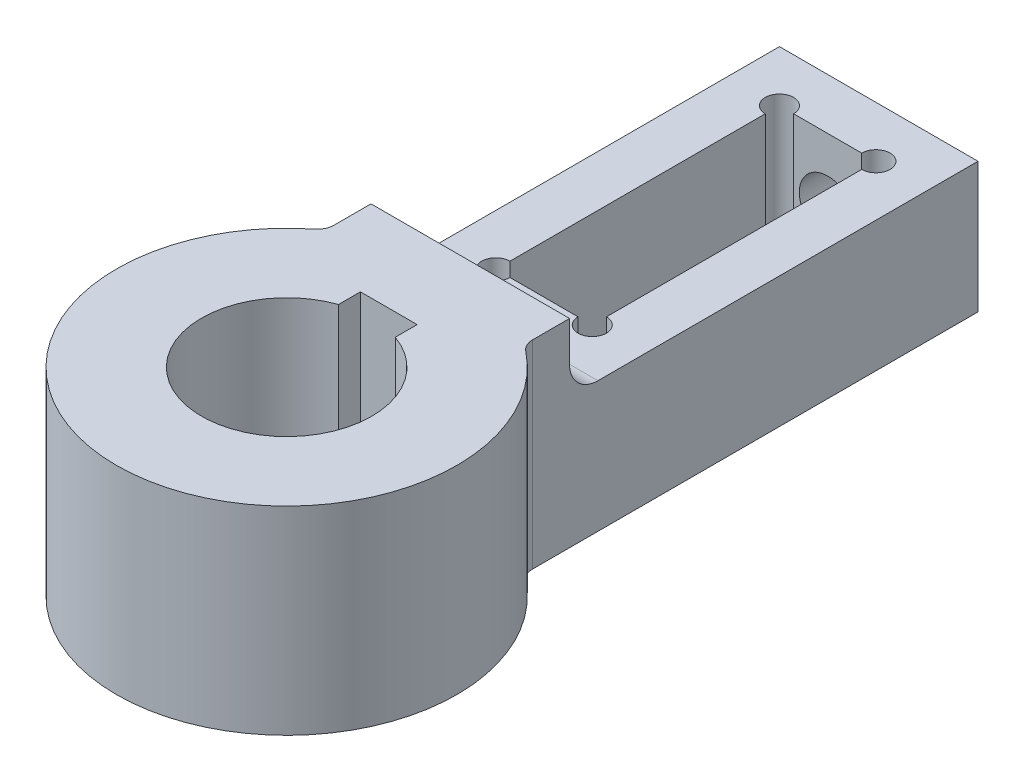
ISO-10303-21;
HEADER;
FILE_DESCRIPTION(('STEP AP214'),'2;1');
FILE_NAME('part.step','',(''),(''),'','','');
FILE_SCHEMA(('AUTOMOTIVE_DESIGN { 1 0 10303 214 1 1 1 1 }'));
ENDSEC;
DATA;
#1=APPLICATION_CONTEXT('core data for automotive mechanical design processes');
#2=APPLICATION_PROTOCOL_DEFINITION('international standard','automotive_design',2000,#1);
#3=PRODUCT_CONTEXT('',#1,'mechanical');
#4=PRODUCT('Part','Part','',(#3));
#5=PRODUCT_RELATED_PRODUCT_CATEGORY('part','',(#4));
#6=PRODUCT_DEFINITION_FORMATION('','',#4);
#7=PRODUCT_DEFINITION_CONTEXT('part definition',#1,'design');
#8=PRODUCT_DEFINITION('design','',#6,#7);
#9=PRODUCT_DEFINITION_SHAPE('','',#8);
#10=(LENGTH_UNIT() NAMED_UNIT(*) SI_UNIT(.MILLI.,.METRE.));
#11=(NAMED_UNIT(*) PLANE_ANGLE_UNIT() SI_UNIT($,.RADIAN.));
#12=(NAMED_UNIT(*) SI_UNIT($,.STERADIAN.) SOLID_ANGLE_UNIT());
#13=UNCERTAINTY_MEASURE_WITH_UNIT(LENGTH_MEASURE(1.E-05),#10,'distance_accuracy_value','');
#14=(GEOMETRIC_REPRESENTATION_CONTEXT(3) GLOBAL_UNCERTAINTY_ASSIGNED_CONTEXT((#13)) GLOBAL_UNIT_ASSIGNED_CONTEXT((#10,
#11,#12)) REPRESENTATION_CONTEXT('',''));
#15=CARTESIAN_POINT('',(0.,0.,0.));
#16=DIRECTION('',(0.,0.,1.));
#17=DIRECTION('',(1.,0.,0.));
#18=AXIS2_PLACEMENT_3D('',#15,#16,#17);
#19=CARTESIAN_POINT('',(0.,35.,0.));
#20=DIRECTION('',(0.,1.,0.));
#21=DIRECTION('',(0.,0.,1.));
#22=AXIS2_PLACEMENT_3D('',#19,#20,#21);
#23=PLANE('',#22);
#24=DIRECTION('',(1.,0.,0.));
#25=VECTOR('',#24,1.);
#26=CARTESIAN_POINT('',(-17.5,35.,-32.3669858620224));
#27=LINE('',#26,#25);
#28=CARTESIAN_POINT('',(-17.5,35.,-32.3669858620224));
#29=VERTEX_POINT('',#28);
#30=CARTESIAN_POINT('',(17.5,35.,-32.3669858620224));
#31=VERTEX_POINT('',#30);
#32=EDGE_CURVE('E181',#29,#31,#27,.T.);
#33=ORIENTED_EDGE('',*,*,#32,.F.);
#34=DIRECTION('',(0.,0.,1.));
#35=VECTOR('',#34,1.);
#36=CARTESIAN_POINT('',(-17.5,35.,-104.366985862022));
#37=LINE('',#36,#35);
#38=CARTESIAN_POINT('',(-17.5,35.,-25.8602010819715));
#39=VERTEX_POINT('',#38);
#40=EDGE_CURVE('E191',#29,#39,#37,.T.);
#41=ORIENTED_EDGE('',*,*,#40,.T.);
#42=CARTESIAN_POINT('',(-20.5,35.,-25.8602010819715));
#43=DIRECTION('',(0.,1.,0.));
#44=DIRECTION('',(0.,0.,1.));
#45=AXIS2_PLACEMENT_3D('',#42,#43,#44);
#46=CIRCLE('',#45,3.);
#47=CARTESIAN_POINT('',(-18.6363636363636,35.,-23.5092737108832));
#48=VERTEX_POINT('',#47);
#49=EDGE_CURVE('E240',#39,#48,#46,.F.);
#50=ORIENTED_EDGE('',*,*,#49,.T.);
#51=CARTESIAN_POINT('',(0.,35.,0.));
#52=DIRECTION('',(0.,1.,0.));
#53=DIRECTION('',(0.,0.,1.));
#54=AXIS2_PLACEMENT_3D('',#51,#52,#53);
#55=CIRCLE('',#54,30.);
#56=CARTESIAN_POINT('',(18.6363636363636,35.,-23.5092737108832));
#57=VERTEX_POINT('',#56);
#58=EDGE_CURVE('E204',#48,#57,#55,.T.);
#59=ORIENTED_EDGE('',*,*,#58,.T.);
#60=CARTESIAN_POINT('',(20.5,35.,-25.8602010819715));
#61=DIRECTION('',(0.,1.,0.));
#62=DIRECTION('',(0.,0.,1.));
#63=AXIS2_PLACEMENT_3D('',#60,#61,#62);
#64=CIRCLE('',#63,3.);
#65=CARTESIAN_POINT('',(17.5,35.,-25.8602010819715));
#66=VERTEX_POINT('',#65);
#67=EDGE_CURVE('E11',#57,#66,#64,.F.);
#68=ORIENTED_EDGE('',*,*,#67,.T.);
#69=DIRECTION('',(0.,0.,-1.));
#70=VECTOR('',#69,1.);
#71=CARTESIAN_POINT('',(17.5,35.,-104.366985862022));
#72=LINE('',#71,#70);
#73=EDGE_CURVE('E193',#66,#31,#72,.T.);
#74=ORIENTED_EDGE('',*,*,#73,.T.);
#75=EDGE_LOOP('',(#33,#41,#50,#59,#68,#74));
#76=FACE_BOUND('',#75,.T.);
#77=DIRECTION('',(0.,0.,-1.));
#78=VECTOR('',#77,1.);
#79=CARTESIAN_POINT('',(5.,35.,-18.));
#80=LINE('',#79,#78);
#81=CARTESIAN_POINT('',(5.,35.,-14.142135623731));
#82=VERTEX_POINT('',#81);
#83=CARTESIAN_POINT('',(5.,35.,-18.));
#84=VERTEX_POINT('',#83);
#85=EDGE_CURVE('E323',#82,#84,#80,.T.);
#86=ORIENTED_EDGE('',*,*,#85,.F.);
#87=CARTESIAN_POINT('',(0.,35.,0.));
#88=DIRECTION('',(0.,1.,0.));
#89=DIRECTION('',(0.,0.,1.));
#90=AXIS2_PLACEMENT_3D('',#87,#88,#89);
#91=CIRCLE('',#90,15.);
#92=CARTESIAN_POINT('',(-5.,35.,-14.142135623731));
#93=VERTEX_POINT('',#92);
#94=EDGE_CURVE('E321',#93,#82,#91,.T.);
#95=ORIENTED_EDGE('',*,*,#94,.F.);
#96=DIRECTION('',(0.,0.,1.));
#97=VECTOR('',#96,1.);
#98=CARTESIAN_POINT('',(-5.,35.,-18.));
#99=LINE('',#98,#97);
#100=CARTESIAN_POINT('',(-5.,35.,-18.));
#101=VERTEX_POINT('',#100);
#102=EDGE_CURVE('E329',#101,#93,#99,.T.);
#103=ORIENTED_EDGE('',*,*,#102,.F.);
#104=DIRECTION('',(-1.,0.,0.));
#105=VECTOR('',#104,1.);
#106=CARTESIAN_POINT('',(-5.,35.,-18.));
#107=LINE('',#106,#105);
#108=EDGE_CURVE('E326',#84,#101,#107,.T.);
#109=ORIENTED_EDGE('',*,*,#108,.F.);
#110=EDGE_LOOP('',(#86,#95,#103,#109));
#111=FACE_BOUND('',#110,.T.);
#112=ADVANCED_FACE('F33',(#76,#111),#23,.T.);
#113=CARTESIAN_POINT('',(0.,0.,0.));
#114=DIRECTION('',(0.,1.,0.));
#115=DIRECTION('',(0.,0.,1.));
#116=AXIS2_PLACEMENT_3D('',#113,#114,#115);
#117=PLANE('',#116);
#118=CARTESIAN_POINT('',(0.,0.,0.));
#119=DIRECTION('',(0.,1.,0.));
#120=DIRECTION('',(0.,0.,1.));
#121=AXIS2_PLACEMENT_3D('',#118,#119,#120);
#122=CIRCLE('',#121,15.);
#123=CARTESIAN_POINT('',(-5.,0.,-14.142135623731));
#124=VERTEX_POINT('',#123);
#125=CARTESIAN_POINT('',(5.,0.,-14.142135623731));
#126=VERTEX_POINT('',#125);
#127=EDGE_CURVE('E320',#124,#126,#122,.T.);
#128=ORIENTED_EDGE('',*,*,#127,.T.);
#129=DIRECTION('',(0.,0.,-1.));
#130=VECTOR('',#129,1.);
#131=CARTESIAN_POINT('',(5.,0.,-18.));
#132=LINE('',#131,#130);
#133=CARTESIAN_POINT('',(5.,0.,-18.));
#134=VERTEX_POINT('',#133);
#135=EDGE_CURVE('E334',#126,#134,#132,.T.);
#136=ORIENTED_EDGE('',*,*,#135,.T.);
#137=DIRECTION('',(-1.,0.,0.));
#138=VECTOR('',#137,1.);
#139=CARTESIAN_POINT('',(-5.,0.,-18.));
#140=LINE('',#139,#138);
#141=CARTESIAN_POINT('',(-5.,0.,-18.));
#142=VERTEX_POINT('',#141);
#143=EDGE_CURVE('E337',#134,#142,#140,.T.);
#144=ORIENTED_EDGE('',*,*,#143,.T.);
#145=DIRECTION('',(0.,0.,1.));
#146=VECTOR('',#145,1.);
#147=CARTESIAN_POINT('',(-5.,0.,-18.));
#148=LINE('',#147,#146);
#149=EDGE_CURVE('E324',#142,#124,#148,.T.);
#150=ORIENTED_EDGE('',*,*,#149,.T.);
#151=EDGE_LOOP('',(#128,#136,#144,#150));
#152=FACE_BOUND('',#151,.T.);
#153=CARTESIAN_POINT('',(0.,0.,0.));
#154=DIRECTION('',(0.,1.,0.));
#155=DIRECTION('',(0.,0.,1.));
#156=AXIS2_PLACEMENT_3D('',#153,#154,#155);
#157=CIRCLE('',#156,30.);
#158=CARTESIAN_POINT('',(-18.6363636363636,0.,-23.5092737108832));
#159=VERTEX_POINT('',#158);
#160=CARTESIAN_POINT('',(18.6363636363636,0.,-23.5092737108832));
#161=VERTEX_POINT('',#160);
#162=EDGE_CURVE('E208',#159,#161,#157,.T.);
#163=ORIENTED_EDGE('',*,*,#162,.F.);
#164=CARTESIAN_POINT('',(-20.5,0.,-25.8602010819715));
#165=DIRECTION('',(0.,1.,0.));
#166=DIRECTION('',(0.,0.,1.));
#167=AXIS2_PLACEMENT_3D('',#164,#165,#166);
#168=CIRCLE('',#167,3.);
#169=CARTESIAN_POINT('',(-17.5,0.,-25.8602010819715));
#170=VERTEX_POINT('',#169);
#171=EDGE_CURVE('E238',#159,#170,#168,.T.);
#172=ORIENTED_EDGE('',*,*,#171,.T.);
#173=DIRECTION('',(0.,0.,1.));
#174=VECTOR('',#173,1.);
#175=CARTESIAN_POINT('',(-17.5,0.,-104.366985862022));
#176=LINE('',#175,#174);
#177=CARTESIAN_POINT('',(-17.5,0.,-104.366985862022));
#178=VERTEX_POINT('',#177);
#179=EDGE_CURVE('E217',#178,#170,#176,.T.);
#180=ORIENTED_EDGE('',*,*,#179,.F.);
#181=DIRECTION('',(-1.,0.,0.));
#182=VECTOR('',#181,1.);
#183=CARTESIAN_POINT('',(-17.5,0.,-104.366985862022));
#184=LINE('',#183,#182);
#185=CARTESIAN_POINT('',(17.5,0.,-104.366985862022));
#186=VERTEX_POINT('',#185);
#187=EDGE_CURVE('E214',#186,#178,#184,.T.);
#188=ORIENTED_EDGE('',*,*,#187,.F.);
#189=DIRECTION('',(0.,0.,-1.));
#190=VECTOR('',#189,1.);
#191=CARTESIAN_POINT('',(17.5,0.,-104.366985862022));
#192=LINE('',#191,#190);
#193=CARTESIAN_POINT('',(17.5,0.,-25.8602010819715));
#194=VERTEX_POINT('',#193);
#195=EDGE_CURVE('E211',#194,#186,#192,.T.);
#196=ORIENTED_EDGE('',*,*,#195,.F.);
#197=CARTESIAN_POINT('',(20.5,0.,-25.8602010819715));
#198=DIRECTION('',(0.,1.,0.));
#199=DIRECTION('',(0.,0.,1.));
#200=AXIS2_PLACEMENT_3D('',#197,#198,#199);
#201=CIRCLE('',#200,3.);
#202=EDGE_CURVE('E42',#194,#161,#201,.T.);
#203=ORIENTED_EDGE('',*,*,#202,.T.);
#204=EDGE_LOOP('',(#163,#172,#180,#188,#196,#203));
#205=FACE_BOUND('',#204,.T.);
#206=CARTESIAN_POINT('',(-8.5,0.,-95.3669858620224));
#207=DIRECTION('',(0.,1.,0.));
#208=DIRECTION('',(0.,0.,1.));
#209=AXIS2_PLACEMENT_3D('',#206,#207,#208);
#210=CIRCLE('',#209,2.5);
#211=CARTESIAN_POINT('',(-6.,0.,-95.3669858620224));
#212=VERTEX_POINT('',#211);
#213=CARTESIAN_POINT('',(-8.5,0.,-92.8669858620224));
#214=VERTEX_POINT('',#213);
#215=EDGE_CURVE('E280',#212,#214,#210,.T.);
#216=ORIENTED_EDGE('',*,*,#215,.T.);
#217=DIRECTION('',(0.,0.,1.));
#218=VECTOR('',#217,1.);
#219=CARTESIAN_POINT('',(-8.5,0.,-47.8669858620224));
#220=LINE('',#219,#218);
#221=CARTESIAN_POINT('',(-8.5,0.,-47.8669858620224));
#222=VERTEX_POINT('',#221);
#223=EDGE_CURVE('E283',#214,#222,#220,.T.);
#224=ORIENTED_EDGE('',*,*,#223,.T.);
#225=CARTESIAN_POINT('',(-8.5,0.,-45.3669858620224));
#226=DIRECTION('',(0.,1.,0.));
#227=DIRECTION('',(0.,0.,1.));
#228=AXIS2_PLACEMENT_3D('',#225,#226,#227);
#229=CIRCLE('',#228,2.5);
#230=CARTESIAN_POINT('',(-6.,0.,-45.3669858620224));
#231=VERTEX_POINT('',#230);
#232=EDGE_CURVE('E286',#222,#231,#229,.T.);
#233=ORIENTED_EDGE('',*,*,#232,.T.);
#234=DIRECTION('',(1.,0.,0.));
#235=VECTOR('',#234,1.);
#236=CARTESIAN_POINT('',(6.00000000000001,0.,-45.3669858620224));
#237=LINE('',#236,#235);
#238=CARTESIAN_POINT('',(6.00000000000001,0.,-45.3669858620224));
#239=VERTEX_POINT('',#238);
#240=EDGE_CURVE('E289',#231,#239,#237,.T.);
#241=ORIENTED_EDGE('',*,*,#240,.T.);
#242=CARTESIAN_POINT('',(8.50000000000001,0.,-45.3669858620224));
#243=DIRECTION('',(0.,1.,0.));
#244=DIRECTION('',(0.,0.,1.));
#245=AXIS2_PLACEMENT_3D('',#242,#243,#244);
#246=CIRCLE('',#245,2.5);
#247=CARTESIAN_POINT('',(8.50000000000001,0.,-47.8669858620224));
#248=VERTEX_POINT('',#247);
#249=EDGE_CURVE('E292',#239,#248,#246,.T.);
#250=ORIENTED_EDGE('',*,*,#249,.T.);
#251=DIRECTION('',(0.,0.,-1.));
#252=VECTOR('',#251,1.);
#253=CARTESIAN_POINT('',(8.50000000000001,0.,-92.8669858620224));
#254=LINE('',#253,#252);
#255=CARTESIAN_POINT('',(8.50000000000001,0.,-92.8669858620224));
#256=VERTEX_POINT('',#255);
#257=EDGE_CURVE('E295',#248,#256,#254,.T.);
#258=ORIENTED_EDGE('',*,*,#257,.T.);
#259=CARTESIAN_POINT('',(8.50000000000001,0.,-95.3669858620224));
#260=DIRECTION('',(0.,1.,0.));
#261=DIRECTION('',(0.,0.,1.));
#262=AXIS2_PLACEMENT_3D('',#259,#260,#261);
#263=CIRCLE('',#262,2.5);
#264=CARTESIAN_POINT('',(6.,0.,-95.3669858620224));
#265=VERTEX_POINT('',#264);
#266=EDGE_CURVE('E298',#256,#265,#263,.T.);
#267=ORIENTED_EDGE('',*,*,#266,.T.);
#268=DIRECTION('',(-1.,0.,0.));
#269=VECTOR('',#268,1.);
#270=CARTESIAN_POINT('',(-6.,0.,-95.3669858620224));
#271=LINE('',#270,#269);
#272=EDGE_CURVE('E301',#265,#212,#271,.T.);
#273=ORIENTED_EDGE('',*,*,#272,.T.);
#274=EDGE_LOOP('',(#216,#224,#233,#241,#250,#258,#267,#273));
#275=FACE_BOUND('',#274,.T.);
#276=ADVANCED_FACE('F245',(#152,#205,#275),#117,.F.);
#277=CARTESIAN_POINT('',(0.,35.,0.));
#278=DIRECTION('',(0.,-1.,0.));
#279=DIRECTION('',(0.,0.,-1.));
#280=AXIS2_PLACEMENT_3D('',#277,#278,#279);
#281=CYLINDRICAL_SURFACE('',#280,30.);
#282=ORIENTED_EDGE('',*,*,#58,.F.);
#283=DIRECTION('',(0.,-1.,0.));
#284=VECTOR('',#283,1.);
#285=CARTESIAN_POINT('',(-18.6363636363636,35.,-23.5092737108832));
#286=LINE('',#285,#284);
#287=EDGE_CURVE('E232',#48,#159,#286,.T.);
#288=ORIENTED_EDGE('',*,*,#287,.T.);
#289=ORIENTED_EDGE('',*,*,#162,.T.);
#290=DIRECTION('',(0.,-1.,0.));
#291=VECTOR('',#290,1.);
#292=CARTESIAN_POINT('',(18.6363636363636,35.,-23.5092737108832));
#293=LINE('',#292,#291);
#294=EDGE_CURVE('E230',#161,#57,#293,.F.);
#295=ORIENTED_EDGE('',*,*,#294,.T.);
#296=EDGE_LOOP('',(#282,#288,#289,#295));
#297=FACE_BOUND('',#296,.T.);
#298=ADVANCED_FACE('F250',(#297),#281,.T.);
#299=CARTESIAN_POINT('',(17.5,35.,-104.366985862022));
#300=DIRECTION('',(-1.,0.,0.));
#301=DIRECTION('',(0.,0.,1.));
#302=AXIS2_PLACEMENT_3D('',#299,#300,#301);
#303=PLANE('',#302);
#304=ORIENTED_EDGE('',*,*,#73,.F.);
#305=DIRECTION('',(0.,1.,0.));
#306=VECTOR('',#305,1.);
#307=CARTESIAN_POINT('',(17.5,0.,-25.8602010819715));
#308=LINE('',#307,#306);
#309=EDGE_CURVE('E236',#66,#194,#308,.F.);
#310=ORIENTED_EDGE('',*,*,#309,.T.);
#311=ORIENTED_EDGE('',*,*,#195,.T.);
#312=DIRECTION('',(0.,-1.,0.));
#313=VECTOR('',#312,1.);
#314=CARTESIAN_POINT('',(17.5,35.,-104.366985862022));
#315=LINE('',#314,#313);
#316=CARTESIAN_POINT('',(17.5,23.,-104.366985862022));
#317=VERTEX_POINT('',#316);
#318=EDGE_CURVE('E202',#317,#186,#315,.T.);
#319=ORIENTED_EDGE('',*,*,#318,.F.);
#320=DIRECTION('',(0.,0.,-1.));
#321=VECTOR('',#320,1.);
#322=CARTESIAN_POINT('',(17.5,23.,-32.3669858620224));
#323=LINE('',#322,#321);
#324=CARTESIAN_POINT('',(17.5,23.,-37.3669858620224));
#325=VERTEX_POINT('',#324);
#326=EDGE_CURVE('E257',#325,#317,#323,.T.);
#327=ORIENTED_EDGE('',*,*,#326,.F.);
#328=CARTESIAN_POINT('',(17.5,28.,-37.3669858620224));
#329=DIRECTION('',(-1.,0.,0.));
#330=DIRECTION('',(0.,0.,1.));
#331=AXIS2_PLACEMENT_3D('',#328,#329,#330);
#332=CIRCLE('',#331,5.);
#333=CARTESIAN_POINT('',(17.5,28.,-32.3669858620224));
#334=VERTEX_POINT('',#333);
#335=EDGE_CURVE('E228',#325,#334,#332,.T.);
#336=ORIENTED_EDGE('',*,*,#335,.T.);
#337=DIRECTION('',(0.,-1.,0.));
#338=VECTOR('',#337,1.);
#339=CARTESIAN_POINT('',(17.5,35.,-32.3669858620224));
#340=LINE('',#339,#338);
#341=EDGE_CURVE('E194',#31,#334,#340,.T.);
#342=ORIENTED_EDGE('',*,*,#341,.F.);
#343=EDGE_LOOP('',(#304,#310,#311,#319,#327,#336,#342));
#344=FACE_BOUND('',#343,.T.);
#345=ADVANCED_FACE('F253',(#344),#303,.F.);
#346=CARTESIAN_POINT('',(-17.5,35.,-104.366985862022));
#347=DIRECTION('',(0.,0.,1.));
#348=DIRECTION('',(1.,0.,0.));
#349=AXIS2_PLACEMENT_3D('',#346,#347,#348);
#350=PLANE('',#349);
#351=CARTESIAN_POINT('',(0.,11.5,-104.366985862022));
#352=DIRECTION('',(0.,0.,-1.));
#353=DIRECTION('',(-1.,0.,0.));
#354=AXIS2_PLACEMENT_3D('',#351,#352,#353);
#355=CIRCLE('',#354,5.);
#356=CARTESIAN_POINT('',(-5.,11.5,-104.366985862022));
#357=VERTEX_POINT('',#356);
#358=EDGE_CURVE('E422',#357,#357,#355,.T.);
#359=ORIENTED_EDGE('',*,*,#358,.F.);
#360=EDGE_LOOP('',(#359));
#361=FACE_BOUND('',#360,.T.);
#362=DIRECTION('',(0.,-1.,0.));
#363=VECTOR('',#362,1.);
#364=CARTESIAN_POINT('',(-17.5,35.,-104.366985862022));
#365=LINE('',#364,#363);
#366=CARTESIAN_POINT('',(-17.5,23.,-104.366985862022));
#367=VERTEX_POINT('',#366);
#368=EDGE_CURVE('E200',#367,#178,#365,.T.);
#369=ORIENTED_EDGE('',*,*,#368,.F.);
#370=DIRECTION('',(-1.,0.,0.));
#371=VECTOR('',#370,1.);
#372=CARTESIAN_POINT('',(-17.5,23.,-104.366985862022));
#373=LINE('',#372,#371);
#374=EDGE_CURVE('E187',#317,#367,#373,.T.);
#375=ORIENTED_EDGE('',*,*,#374,.F.);
#376=ORIENTED_EDGE('',*,*,#318,.T.);
#377=ORIENTED_EDGE('',*,*,#187,.T.);
#378=EDGE_LOOP('',(#369,#375,#376,#377));
#379=FACE_BOUND('',#378,.T.);
#380=ADVANCED_FACE('F356',(#361,#379),#350,.F.);
#381=CARTESIAN_POINT('',(-17.5,35.,-104.366985862022));
#382=DIRECTION('',(1.,0.,0.));
#383=DIRECTION('',(0.,0.,-1.));
#384=AXIS2_PLACEMENT_3D('',#381,#382,#383);
#385=PLANE('',#384);
#386=ORIENTED_EDGE('',*,*,#179,.T.);
#387=DIRECTION('',(0.,1.,0.));
#388=VECTOR('',#387,1.);
#389=CARTESIAN_POINT('',(-17.5,35.,-25.8602010819715));
#390=LINE('',#389,#388);
#391=EDGE_CURVE('E199',#170,#39,#390,.T.);
#392=ORIENTED_EDGE('',*,*,#391,.T.);
#393=ORIENTED_EDGE('',*,*,#40,.F.);
#394=DIRECTION('',(0.,1.,0.));
#395=VECTOR('',#394,1.);
#396=CARTESIAN_POINT('',(-17.5,35.,-32.3669858620224));
#397=LINE('',#396,#395);
#398=CARTESIAN_POINT('',(-17.5,28.,-32.3669858620224));
#399=VERTEX_POINT('',#398);
#400=EDGE_CURVE('E177',#399,#29,#397,.T.);
#401=ORIENTED_EDGE('',*,*,#400,.F.);
#402=CARTESIAN_POINT('',(-17.5,28.,-37.3669858620224));
#403=DIRECTION('',(1.,0.,0.));
#404=DIRECTION('',(0.,0.,-1.));
#405=AXIS2_PLACEMENT_3D('',#402,#403,#404);
#406=CIRCLE('',#405,5.);
#407=CARTESIAN_POINT('',(-17.5,23.,-37.3669858620224));
#408=VERTEX_POINT('',#407);
#409=EDGE_CURVE('E226',#399,#408,#406,.T.);
#410=ORIENTED_EDGE('',*,*,#409,.T.);
#411=DIRECTION('',(0.,0.,-1.));
#412=VECTOR('',#411,1.);
#413=CARTESIAN_POINT('',(-17.5,23.,-32.3669858620224));
#414=LINE('',#413,#412);
#415=EDGE_CURVE('E259',#408,#367,#414,.T.);
#416=ORIENTED_EDGE('',*,*,#415,.T.);
#417=ORIENTED_EDGE('',*,*,#368,.T.);
#418=EDGE_LOOP('',(#386,#392,#393,#401,#410,#416,#417));
#419=FACE_BOUND('',#418,.T.);
#420=ADVANCED_FACE('F197',(#419),#385,.F.);
#421=CARTESIAN_POINT('',(0.,35.,0.));
#422=DIRECTION('',(0.,-1.,0.));
#423=DIRECTION('',(0.,0.,-1.));
#424=AXIS2_PLACEMENT_3D('',#421,#422,#423);
#425=CYLINDRICAL_SURFACE('',#424,15.);
#426=ORIENTED_EDGE('',*,*,#127,.F.);
#427=DIRECTION('',(0.,-1.,0.));
#428=VECTOR('',#427,1.);
#429=CARTESIAN_POINT('',(-5.,35.,-14.142135623731));
#430=LINE('',#429,#428);
#431=EDGE_CURVE('E331',#93,#124,#430,.T.);
#432=ORIENTED_EDGE('',*,*,#431,.F.);
#433=ORIENTED_EDGE('',*,*,#94,.T.);
#434=DIRECTION('',(0.,-1.,0.));
#435=VECTOR('',#434,1.);
#436=CARTESIAN_POINT('',(5.,35.,-14.142135623731));
#437=LINE('',#436,#435);
#438=EDGE_CURVE('E212',#82,#126,#437,.T.);
#439=ORIENTED_EDGE('',*,*,#438,.T.);
#440=EDGE_LOOP('',(#426,#432,#433,#439));
#441=FACE_BOUND('',#440,.T.);
#442=ADVANCED_FACE('F382',(#441),#425,.F.);
#443=CARTESIAN_POINT('',(5.,35.,-18.));
#444=DIRECTION('',(-1.,0.,0.));
#445=DIRECTION('',(0.,0.,1.));
#446=AXIS2_PLACEMENT_3D('',#443,#444,#445);
#447=PLANE('',#446);
#448=ORIENTED_EDGE('',*,*,#135,.F.);
#449=ORIENTED_EDGE('',*,*,#438,.F.);
#450=ORIENTED_EDGE('',*,*,#85,.T.);
#451=DIRECTION('',(0.,-1.,0.));
#452=VECTOR('',#451,1.);
#453=CARTESIAN_POINT('',(5.,35.,-18.));
#454=LINE('',#453,#452);
#455=EDGE_CURVE('E346',#84,#134,#454,.T.);
#456=ORIENTED_EDGE('',*,*,#455,.T.);
#457=EDGE_LOOP('',(#448,#449,#450,#456));
#458=FACE_BOUND('',#457,.T.);
#459=ADVANCED_FACE('F491',(#458),#447,.T.);
#460=CARTESIAN_POINT('',(-5.,35.,-18.));
#461=DIRECTION('',(0.,0.,1.));
#462=DIRECTION('',(1.,0.,0.));
#463=AXIS2_PLACEMENT_3D('',#460,#461,#462);
#464=PLANE('',#463);
#465=ORIENTED_EDGE('',*,*,#143,.F.);
#466=ORIENTED_EDGE('',*,*,#455,.F.);
#467=ORIENTED_EDGE('',*,*,#108,.T.);
#468=DIRECTION('',(0.,-1.,0.));
#469=VECTOR('',#468,1.);
#470=CARTESIAN_POINT('',(-5.,35.,-18.));
#471=LINE('',#470,#469);
#472=EDGE_CURVE('E344',#101,#142,#471,.T.);
#473=ORIENTED_EDGE('',*,*,#472,.T.);
#474=EDGE_LOOP('',(#465,#466,#467,#473));
#475=FACE_BOUND('',#474,.T.);
#476=ADVANCED_FACE('F488',(#475),#464,.T.);
#477=CARTESIAN_POINT('',(-5.,35.,-18.));
#478=DIRECTION('',(1.,0.,0.));
#479=DIRECTION('',(0.,0.,-1.));
#480=AXIS2_PLACEMENT_3D('',#477,#478,#479);
#481=PLANE('',#480);
#482=ORIENTED_EDGE('',*,*,#149,.F.);
#483=ORIENTED_EDGE('',*,*,#472,.F.);
#484=ORIENTED_EDGE('',*,*,#102,.T.);
#485=ORIENTED_EDGE('',*,*,#431,.T.);
#486=EDGE_LOOP('',(#482,#483,#484,#485));
#487=FACE_BOUND('',#486,.T.);
#488=ADVANCED_FACE('F485',(#487),#481,.T.);
#489=CARTESIAN_POINT('',(-8.5,35.,-95.3669858620224));
#490=DIRECTION('',(0.,-1.,0.));
#491=DIRECTION('',(0.,0.,-1.));
#492=AXIS2_PLACEMENT_3D('',#489,#490,#491);
#493=CYLINDRICAL_SURFACE('',#492,2.5);
#494=CARTESIAN_POINT('',(-8.5,23.,-95.3669858620224));
#495=DIRECTION('',(0.,-1.,0.));
#496=DIRECTION('',(1.,0.,0.));
#497=AXIS2_PLACEMENT_3D('',#494,#495,#496);
#498=CIRCLE('',#497,2.5);
#499=CARTESIAN_POINT('',(-8.5,23.,-92.8669858620224));
#500=VERTEX_POINT('',#499);
#501=CARTESIAN_POINT('',(-6.,23.,-95.3669858620224));
#502=VERTEX_POINT('',#501);
#503=EDGE_CURVE('E278',#500,#502,#498,.T.);
#504=ORIENTED_EDGE('',*,*,#503,.F.);
#505=DIRECTION('',(0.,-1.,0.));
#506=VECTOR('',#505,1.);
#507=CARTESIAN_POINT('',(-8.5,35.,-92.8669858620224));
#508=LINE('',#507,#506);
#509=EDGE_CURVE('E318',#500,#214,#508,.T.);
#510=ORIENTED_EDGE('',*,*,#509,.T.);
#511=ORIENTED_EDGE('',*,*,#215,.F.);
#512=DIRECTION('',(0.,-1.,0.));
#513=VECTOR('',#512,1.);
#514=CARTESIAN_POINT('',(-6.,35.,-95.3669858620224));
#515=LINE('',#514,#513);
#516=EDGE_CURVE('E304',#502,#212,#515,.T.);
#517=ORIENTED_EDGE('',*,*,#516,.F.);
#518=EDGE_LOOP('',(#504,#510,#511,#517));
#519=FACE_BOUND('',#518,.T.);
#520=ADVANCED_FACE('F457',(#519),#493,.F.);
#521=CARTESIAN_POINT('',(-8.5,35.,-47.8669858620224));
#522=DIRECTION('',(1.,0.,0.));
#523=DIRECTION('',(0.,0.,-1.));
#524=AXIS2_PLACEMENT_3D('',#521,#522,#523);
#525=PLANE('',#524);
#526=DIRECTION('',(0.,0.,-1.));
#527=VECTOR('',#526,1.);
#528=CARTESIAN_POINT('',(-8.5,23.,-47.8669858620224));
#529=LINE('',#528,#527);
#530=CARTESIAN_POINT('',(-8.5,23.,-47.8669858620224));
#531=VERTEX_POINT('',#530);
#532=EDGE_CURVE('E276',#531,#500,#529,.T.);
#533=ORIENTED_EDGE('',*,*,#532,.F.);
#534=DIRECTION('',(0.,-1.,0.));
#535=VECTOR('',#534,1.);
#536=CARTESIAN_POINT('',(-8.5,35.,-47.8669858620224));
#537=LINE('',#536,#535);
#538=EDGE_CURVE('E316',#531,#222,#537,.T.);
#539=ORIENTED_EDGE('',*,*,#538,.T.);
#540=ORIENTED_EDGE('',*,*,#223,.F.);
#541=ORIENTED_EDGE('',*,*,#509,.F.);
#542=EDGE_LOOP('',(#533,#539,#540,#541));
#543=FACE_BOUND('',#542,.T.);
#544=ADVANCED_FACE('F454',(#543),#525,.T.);
#545=CARTESIAN_POINT('',(-8.5,35.,-45.3669858620224));
#546=DIRECTION('',(0.,-1.,0.));
#547=DIRECTION('',(0.,0.,-1.));
#548=AXIS2_PLACEMENT_3D('',#545,#546,#547);
#549=CYLINDRICAL_SURFACE('',#548,2.5);
#550=CARTESIAN_POINT('',(-8.5,23.,-45.3669858620224));
#551=DIRECTION('',(0.,-1.,0.));
#552=DIRECTION('',(1.,0.,0.));
#553=AXIS2_PLACEMENT_3D('',#550,#551,#552);
#554=CIRCLE('',#553,2.5);
#555=CARTESIAN_POINT('',(-6.,23.,-45.3669858620224));
#556=VERTEX_POINT('',#555);
#557=EDGE_CURVE('E274',#556,#531,#554,.T.);
#558=ORIENTED_EDGE('',*,*,#557,.F.);
#559=DIRECTION('',(0.,-1.,0.));
#560=VECTOR('',#559,1.);
#561=CARTESIAN_POINT('',(-6.,35.,-45.3669858620224));
#562=LINE('',#561,#560);
#563=EDGE_CURVE('E314',#556,#231,#562,.T.);
#564=ORIENTED_EDGE('',*,*,#563,.T.);
#565=ORIENTED_EDGE('',*,*,#232,.F.);
#566=ORIENTED_EDGE('',*,*,#538,.F.);
#567=EDGE_LOOP('',(#558,#564,#565,#566));
#568=FACE_BOUND('',#567,.T.);
#569=ADVANCED_FACE('F434',(#568),#549,.F.);
#570=CARTESIAN_POINT('',(6.00000000000001,35.,-45.3669858620224));
#571=DIRECTION('',(0.,0.,-1.));
#572=DIRECTION('',(-1.,0.,0.));
#573=AXIS2_PLACEMENT_3D('',#570,#571,#572);
#574=PLANE('',#573);
#575=CARTESIAN_POINT('',(0.,11.5,-45.3669858620224));
#576=DIRECTION('',(0.,0.,-1.));
#577=DIRECTION('',(-1.,0.,0.));
#578=AXIS2_PLACEMENT_3D('',#575,#576,#577);
#579=CIRCLE('',#578,5.);
#580=CARTESIAN_POINT('',(-5.,11.5,-45.3669858620224));
#581=VERTEX_POINT('',#580);
#582=EDGE_CURVE('E264',#581,#581,#579,.T.);
#583=ORIENTED_EDGE('',*,*,#582,.F.);
#584=EDGE_LOOP('',(#583));
#585=FACE_BOUND('',#584,.T.);
#586=DIRECTION('',(-1.,0.,0.));
#587=VECTOR('',#586,1.);
#588=CARTESIAN_POINT('',(6.,23.,-45.3669858620224));
#589=LINE('',#588,#587);
#590=CARTESIAN_POINT('',(6.,23.,-45.3669858620224));
#591=VERTEX_POINT('',#590);
#592=EDGE_CURVE('E272',#591,#556,#589,.T.);
#593=ORIENTED_EDGE('',*,*,#592,.F.);
#594=DIRECTION('',(0.,-1.,0.));
#595=VECTOR('',#594,1.);
#596=CARTESIAN_POINT('',(6.00000000000001,35.,-45.3669858620224));
#597=LINE('',#596,#595);
#598=EDGE_CURVE('E312',#591,#239,#597,.T.);
#599=ORIENTED_EDGE('',*,*,#598,.T.);
#600=ORIENTED_EDGE('',*,*,#240,.F.);
#601=ORIENTED_EDGE('',*,*,#563,.F.);
#602=EDGE_LOOP('',(#593,#599,#600,#601));
#603=FACE_BOUND('',#602,.T.);
#604=ADVANCED_FACE('F430',(#585,#603),#574,.T.);
#605=CARTESIAN_POINT('',(8.50000000000001,35.,-45.3669858620224));
#606=DIRECTION('',(0.,-1.,0.));
#607=DIRECTION('',(0.,0.,-1.));
#608=AXIS2_PLACEMENT_3D('',#605,#606,#607);
#609=CYLINDRICAL_SURFACE('',#608,2.5);
#610=CARTESIAN_POINT('',(8.50000000000001,23.,-45.3669858620224));
#611=DIRECTION('',(0.,-1.,0.));
#612=DIRECTION('',(1.,0.,0.));
#613=AXIS2_PLACEMENT_3D('',#610,#611,#612);
#614=CIRCLE('',#613,2.5);
#615=CARTESIAN_POINT('',(8.50000000000001,23.,-47.8669858620224));
#616=VERTEX_POINT('',#615);
#617=EDGE_CURVE('E270',#616,#591,#614,.T.);
#618=ORIENTED_EDGE('',*,*,#617,.F.);
#619=DIRECTION('',(0.,-1.,0.));
#620=VECTOR('',#619,1.);
#621=CARTESIAN_POINT('',(8.50000000000001,35.,-47.8669858620224));
#622=LINE('',#621,#620);
#623=EDGE_CURVE('E310',#616,#248,#622,.T.);
#624=ORIENTED_EDGE('',*,*,#623,.T.);
#625=ORIENTED_EDGE('',*,*,#249,.F.);
#626=ORIENTED_EDGE('',*,*,#598,.F.);
#627=EDGE_LOOP('',(#618,#624,#625,#626));
#628=FACE_BOUND('',#627,.T.);
#629=ADVANCED_FACE('F433',(#628),#609,.F.);
#630=CARTESIAN_POINT('',(8.50000000000001,35.,-92.8669858620224));
#631=DIRECTION('',(-1.,0.,0.));
#632=DIRECTION('',(0.,0.,1.));
#633=AXIS2_PLACEMENT_3D('',#630,#631,#632);
#634=PLANE('',#633);
#635=DIRECTION('',(0.,0.,1.));
#636=VECTOR('',#635,1.);
#637=CARTESIAN_POINT('',(8.50000000000001,23.,-92.8669858620224));
#638=LINE('',#637,#636);
#639=CARTESIAN_POINT('',(8.50000000000001,23.,-92.8669858620224));
#640=VERTEX_POINT('',#639);
#641=EDGE_CURVE('E268',#640,#616,#638,.T.);
#642=ORIENTED_EDGE('',*,*,#641,.F.);
#643=DIRECTION('',(0.,-1.,0.));
#644=VECTOR('',#643,1.);
#645=CARTESIAN_POINT('',(8.50000000000001,35.,-92.8669858620224));
#646=LINE('',#645,#644);
#647=EDGE_CURVE('E308',#640,#256,#646,.T.);
#648=ORIENTED_EDGE('',*,*,#647,.T.);
#649=ORIENTED_EDGE('',*,*,#257,.F.);
#650=ORIENTED_EDGE('',*,*,#623,.F.);
#651=EDGE_LOOP('',(#642,#648,#649,#650));
#652=FACE_BOUND('',#651,.T.);
#653=ADVANCED_FACE('F469',(#652),#634,.T.);
#654=CARTESIAN_POINT('',(8.50000000000001,35.,-95.3669858620224));
#655=DIRECTION('',(0.,-1.,0.));
#656=DIRECTION('',(0.,0.,-1.));
#657=AXIS2_PLACEMENT_3D('',#654,#655,#656);
#658=CYLINDRICAL_SURFACE('',#657,2.5);
#659=CARTESIAN_POINT('',(8.50000000000001,23.,-95.3669858620224));
#660=DIRECTION('',(0.,-1.,0.));
#661=DIRECTION('',(1.,0.,0.));
#662=AXIS2_PLACEMENT_3D('',#659,#660,#661);
#663=CIRCLE('',#662,2.5);
#664=CARTESIAN_POINT('',(6.,23.,-95.3669858620224));
#665=VERTEX_POINT('',#664);
#666=EDGE_CURVE('E265',#665,#640,#663,.T.);
#667=ORIENTED_EDGE('',*,*,#666,.F.);
#668=DIRECTION('',(0.,-1.,0.));
#669=VECTOR('',#668,1.);
#670=CARTESIAN_POINT('',(6.,35.,-95.3669858620224));
#671=LINE('',#670,#669);
#672=EDGE_CURVE('E306',#665,#265,#671,.T.);
#673=ORIENTED_EDGE('',*,*,#672,.T.);
#674=ORIENTED_EDGE('',*,*,#266,.F.);
#675=ORIENTED_EDGE('',*,*,#647,.F.);
#676=EDGE_LOOP('',(#667,#673,#674,#675));
#677=FACE_BOUND('',#676,.T.);
#678=ADVANCED_FACE('F371',(#677),#658,.F.);
#679=CARTESIAN_POINT('',(-6.,35.,-95.3669858620224));
#680=DIRECTION('',(0.,0.,1.));
#681=DIRECTION('',(1.,0.,0.));
#682=AXIS2_PLACEMENT_3D('',#679,#680,#681);
#683=PLANE('',#682);
#684=CARTESIAN_POINT('',(0.,11.5,-95.3669858620224));
#685=DIRECTION('',(0.,0.,1.));
#686=DIRECTION('',(1.,0.,0.));
#687=AXIS2_PLACEMENT_3D('',#684,#685,#686);
#688=CIRCLE('',#687,5.);
#689=CARTESIAN_POINT('',(5.,11.5,-95.3669858620224));
#690=VERTEX_POINT('',#689);
#691=EDGE_CURVE('E37',#690,#690,#688,.T.);
#692=ORIENTED_EDGE('',*,*,#691,.F.);
#693=EDGE_LOOP('',(#692));
#694=FACE_BOUND('',#693,.T.);
#695=DIRECTION('',(1.,0.,0.));
#696=VECTOR('',#695,1.);
#697=CARTESIAN_POINT('',(-6.,23.,-95.3669858620224));
#698=LINE('',#697,#696);
#699=EDGE_CURVE('E221',#502,#665,#698,.T.);
#700=ORIENTED_EDGE('',*,*,#699,.F.);
#701=ORIENTED_EDGE('',*,*,#516,.T.);
#702=ORIENTED_EDGE('',*,*,#272,.F.);
#703=ORIENTED_EDGE('',*,*,#672,.F.);
#704=EDGE_LOOP('',(#700,#701,#702,#703));
#705=FACE_BOUND('',#704,.T.);
#706=ADVANCED_FACE('F363',(#694,#705),#683,.T.);
#707=CARTESIAN_POINT('',(-17.5,23.,-32.3669858620224));
#708=DIRECTION('',(0.,-1.,0.));
#709=DIRECTION('',(1.,0.,0.));
#710=AXIS2_PLACEMENT_3D('',#707,#708,#709);
#711=PLANE('',#710);
#712=ORIENTED_EDGE('',*,*,#503,.T.);
#713=ORIENTED_EDGE('',*,*,#699,.T.);
#714=ORIENTED_EDGE('',*,*,#666,.T.);
#715=ORIENTED_EDGE('',*,*,#641,.T.);
#716=ORIENTED_EDGE('',*,*,#617,.T.);
#717=ORIENTED_EDGE('',*,*,#592,.T.);
#718=ORIENTED_EDGE('',*,*,#557,.T.);
#719=ORIENTED_EDGE('',*,*,#532,.T.);
#720=EDGE_LOOP('',(#712,#713,#714,#715,#716,#717,#718,#719));
#721=FACE_BOUND('',#720,.T.);
#722=ORIENTED_EDGE('',*,*,#415,.F.);
#723=DIRECTION('',(-1.,0.,0.));
#724=VECTOR('',#723,1.);
#725=CARTESIAN_POINT('',(17.5,23.,-37.3669858620224));
#726=LINE('',#725,#724);
#727=EDGE_CURVE('E224',#408,#325,#726,.F.);
#728=ORIENTED_EDGE('',*,*,#727,.T.);
#729=ORIENTED_EDGE('',*,*,#326,.T.);
#730=ORIENTED_EDGE('',*,*,#374,.T.);
#731=EDGE_LOOP('',(#722,#728,#729,#730));
#732=FACE_BOUND('',#731,.T.);
#733=ADVANCED_FACE('F361',(#721,#732),#711,.F.);
#734=CARTESIAN_POINT('',(0.,0.,-32.3669858620224));
#735=DIRECTION('',(0.,0.,1.));
#736=DIRECTION('',(1.,0.,0.));
#737=AXIS2_PLACEMENT_3D('',#734,#735,#736);
#738=PLANE('',#737);
#739=ORIENTED_EDGE('',*,*,#341,.T.);
#740=DIRECTION('',(-1.,0.,0.));
#741=VECTOR('',#740,1.);
#742=CARTESIAN_POINT('',(-17.5,28.,-32.3669858620224));
#743=LINE('',#742,#741);
#744=EDGE_CURVE('E184',#334,#399,#743,.T.);
#745=ORIENTED_EDGE('',*,*,#744,.T.);
#746=ORIENTED_EDGE('',*,*,#400,.T.);
#747=ORIENTED_EDGE('',*,*,#32,.T.);
#748=EDGE_LOOP('',(#739,#745,#746,#747));
#749=FACE_BOUND('',#748,.T.);
#750=ADVANCED_FACE('F180',(#749),#738,.F.);
#751=CARTESIAN_POINT('',(0.,28.,-37.3669858620224));
#752=DIRECTION('',(1.,0.,0.));
#753=DIRECTION('',(0.,1.,0.));
#754=AXIS2_PLACEMENT_3D('',#751,#752,#753);
#755=CYLINDRICAL_SURFACE('',#754,5.);
#756=ORIENTED_EDGE('',*,*,#335,.F.);
#757=ORIENTED_EDGE('',*,*,#727,.F.);
#758=ORIENTED_EDGE('',*,*,#409,.F.);
#759=ORIENTED_EDGE('',*,*,#744,.F.);
#760=EDGE_LOOP('',(#756,#757,#758,#759));
#761=FACE_BOUND('',#760,.T.);
#762=ADVANCED_FACE('F360',(#761),#755,.F.);
#763=CARTESIAN_POINT('',(-20.5,35.,-25.8602010819715));
#764=DIRECTION('',(0.,-1.,0.));
#765=DIRECTION('',(0.,0.,-1.));
#766=AXIS2_PLACEMENT_3D('',#763,#764,#765);
#767=CYLINDRICAL_SURFACE('',#766,3.);
#768=ORIENTED_EDGE('',*,*,#49,.F.);
#769=ORIENTED_EDGE('',*,*,#391,.F.);
#770=ORIENTED_EDGE('',*,*,#171,.F.);
#771=ORIENTED_EDGE('',*,*,#287,.F.);
#772=EDGE_LOOP('',(#768,#769,#770,#771));
#773=FACE_BOUND('',#772,.T.);
#774=ADVANCED_FACE('F350',(#773),#767,.F.);
#775=CARTESIAN_POINT('',(20.5,35.,-25.8602010819715));
#776=DIRECTION('',(0.,-1.,0.));
#777=DIRECTION('',(0.,0.,-1.));
#778=AXIS2_PLACEMENT_3D('',#775,#776,#777);
#779=CYLINDRICAL_SURFACE('',#778,3.);
#780=ORIENTED_EDGE('',*,*,#67,.F.);
#781=ORIENTED_EDGE('',*,*,#294,.F.);
#782=ORIENTED_EDGE('',*,*,#202,.F.);
#783=ORIENTED_EDGE('',*,*,#309,.F.);
#784=EDGE_LOOP('',(#780,#781,#782,#783));
#785=FACE_BOUND('',#784,.T.);
#786=ADVANCED_FACE('F35',(#785),#779,.F.);
#787=CARTESIAN_POINT('',(0.,11.5,-39.3669858620224));
#788=DIRECTION('',(0.,0.,-1.));
#789=DIRECTION('',(-1.,0.,0.));
#790=AXIS2_PLACEMENT_3D('',#787,#788,#789);
#791=CYLINDRICAL_SURFACE('',#790,5.);
#792=ORIENTED_EDGE('',*,*,#691,.T.);
#793=EDGE_LOOP('',(#792));
#794=FACE_BOUND('',#793,.T.);
#795=ORIENTED_EDGE('',*,*,#358,.T.);
#796=EDGE_LOOP('',(#795));
#797=FACE_BOUND('',#796,.T.);
#798=ADVANCED_FACE('F399',(#794,#797),#791,.F.);
#799=ORIENTED_EDGE('',*,*,#582,.T.);
#800=EDGE_LOOP('',(#799));
#801=FACE_BOUND('',#800,.T.);
#802=CARTESIAN_POINT('',(0.,11.5,-39.3669858620224));
#803=DIRECTION('',(0.,0.,-1.));
#804=DIRECTION('',(-1.,0.,0.));
#805=AXIS2_PLACEMENT_3D('',#802,#803,#804);
#806=CIRCLE('',#805,5.);
#807=CARTESIAN_POINT('',(-5.,11.5,-39.3669858620224));
#808=VERTEX_POINT('',#807);
#809=EDGE_CURVE('E420',#808,#808,#806,.T.);
#810=ORIENTED_EDGE('',*,*,#809,.F.);
#811=EDGE_LOOP('',(#810));
#812=FACE_BOUND('',#811,.T.);
#813=ADVANCED_FACE('F403',(#801,#812),#791,.F.);
#814=CARTESIAN_POINT('',(0.,11.5,-39.3669858620224));
#815=DIRECTION('',(0.,0.,-1.));
#816=DIRECTION('',(-1.,0.,0.));
#817=AXIS2_PLACEMENT_3D('',#814,#815,#816);
#818=PLANE('',#817);
#819=ORIENTED_EDGE('',*,*,#809,.T.);
#820=EDGE_LOOP('',(#819));
#821=FACE_BOUND('',#820,.T.);
#822=ADVANCED_FACE('F409',(#821),#818,.T.);
#823=CLOSED_SHELL('',(#112,#276,#298,#345,#380,#420,#442,#459,#476,#488,#520,#544,#569,#604,
#629,#653,#678,#706,#733,#750,#762,#774,#786,#798,#813,#822));
#824=MANIFOLD_SOLID_BREP('B2',#823);
#825=ADVANCED_BREP_SHAPE_REPRESENTATION('',(#18,#824),#14);
#826=SHAPE_DEFINITION_REPRESENTATION(#9,#825);
ENDSEC;
END-ISO-10303-21;
